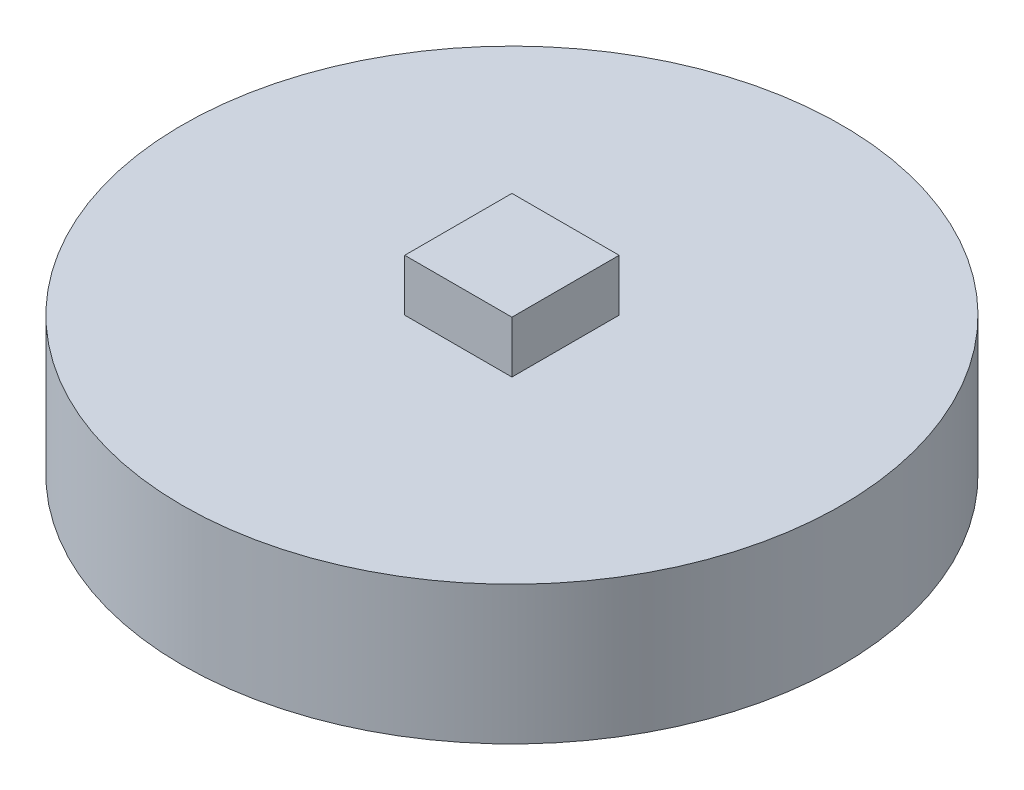
ISO-10303-21;
HEADER;
FILE_DESCRIPTION(('STEP AP214'),'2;1');
FILE_NAME('part.step','',(''),(''),'','','');
FILE_SCHEMA(('AUTOMOTIVE_DESIGN { 1 0 10303 214 1 1 1 1 }'));
ENDSEC;
DATA;
#1=APPLICATION_CONTEXT('core data for automotive mechanical design processes');
#2=APPLICATION_PROTOCOL_DEFINITION('international standard','automotive_design',2000,#1);
#3=PRODUCT_CONTEXT('',#1,'mechanical');
#4=PRODUCT('Part','Part','',(#3));
#5=PRODUCT_RELATED_PRODUCT_CATEGORY('part','',(#4));
#6=PRODUCT_DEFINITION_FORMATION('','',#4);
#7=PRODUCT_DEFINITION_CONTEXT('part definition',#1,'design');
#8=PRODUCT_DEFINITION('design','',#6,#7);
#9=PRODUCT_DEFINITION_SHAPE('','',#8);
#10=(LENGTH_UNIT() NAMED_UNIT(*) SI_UNIT(.MILLI.,.METRE.));
#11=(NAMED_UNIT(*) PLANE_ANGLE_UNIT() SI_UNIT($,.RADIAN.));
#12=(NAMED_UNIT(*) SI_UNIT($,.STERADIAN.) SOLID_ANGLE_UNIT());
#13=UNCERTAINTY_MEASURE_WITH_UNIT(LENGTH_MEASURE(1.E-05),#10,'distance_accuracy_value','');
#14=(GEOMETRIC_REPRESENTATION_CONTEXT(3) GLOBAL_UNCERTAINTY_ASSIGNED_CONTEXT((#13)) GLOBAL_UNIT_ASSIGNED_CONTEXT((#10,
#11,#12)) REPRESENTATION_CONTEXT('',''));
#15=CARTESIAN_POINT('',(0.,0.,0.));
#16=DIRECTION('',(0.,0.,1.));
#17=DIRECTION('',(1.,0.,0.));
#18=AXIS2_PLACEMENT_3D('',#15,#16,#17);
#19=CARTESIAN_POINT('',(0.,8.,0.));
#20=DIRECTION('',(0.,-1.,0.));
#21=DIRECTION('',(0.,0.,-1.));
#22=AXIS2_PLACEMENT_3D('',#19,#20,#21);
#23=CYLINDRICAL_SURFACE('',#22,19.06);
#24=CARTESIAN_POINT('',(0.,8.,0.));
#25=DIRECTION('',(0.,1.,0.));
#26=DIRECTION('',(0.,0.,1.));
#27=AXIS2_PLACEMENT_3D('',#24,#25,#26);
#28=CIRCLE('',#27,19.06);
#29=CARTESIAN_POINT('',(0.,8.,19.06));
#30=VERTEX_POINT('',#29);
#31=EDGE_CURVE('E11',#30,#30,#28,.T.);
#32=ORIENTED_EDGE('',*,*,#31,.F.);
#33=EDGE_LOOP('',(#32));
#34=FACE_BOUND('',#33,.T.);
#35=CARTESIAN_POINT('',(0.,0.,0.));
#36=DIRECTION('',(0.,1.,0.));
#37=DIRECTION('',(0.,0.,1.));
#38=AXIS2_PLACEMENT_3D('',#35,#36,#37);
#39=CIRCLE('',#38,19.06);
#40=CARTESIAN_POINT('',(0.,0.,19.06));
#41=VERTEX_POINT('',#40);
#42=EDGE_CURVE('E42',#41,#41,#39,.T.);
#43=ORIENTED_EDGE('',*,*,#42,.T.);
#44=EDGE_LOOP('',(#43));
#45=FACE_BOUND('',#44,.T.);
#46=ADVANCED_FACE('F39',(#34,#45),#23,.T.);
#47=CARTESIAN_POINT('',(0.,8.,0.));
#48=DIRECTION('',(0.,1.,0.));
#49=DIRECTION('',(0.,0.,1.));
#50=AXIS2_PLACEMENT_3D('',#47,#48,#49);
#51=PLANE('',#50);
#52=DIRECTION('',(0.,0.,1.));
#53=VECTOR('',#52,1.);
#54=CARTESIAN_POINT('',(-3.1,8.,3.1));
#55=LINE('',#54,#53);
#56=CARTESIAN_POINT('',(-3.1,8.,-3.1));
#57=VERTEX_POINT('',#56);
#58=CARTESIAN_POINT('',(-3.1,8.,3.1));
#59=VERTEX_POINT('',#58);
#60=EDGE_CURVE('E53',#57,#59,#55,.T.);
#61=ORIENTED_EDGE('',*,*,#60,.F.);
#62=DIRECTION('',(-1.,0.,0.));
#63=VECTOR('',#62,1.);
#64=CARTESIAN_POINT('',(0.,8.,-3.1));
#65=LINE('',#64,#63);
#66=CARTESIAN_POINT('',(3.1,8.,-3.1));
#67=VERTEX_POINT('',#66);
#68=EDGE_CURVE('E57',#67,#57,#65,.T.);
#69=ORIENTED_EDGE('',*,*,#68,.F.);
#70=DIRECTION('',(0.,0.,-1.));
#71=VECTOR('',#70,1.);
#72=CARTESIAN_POINT('',(3.1,8.,-3.1));
#73=LINE('',#72,#71);
#74=CARTESIAN_POINT('',(3.1,8.,3.1));
#75=VERTEX_POINT('',#74);
#76=EDGE_CURVE('E108',#75,#67,#73,.T.);
#77=ORIENTED_EDGE('',*,*,#76,.F.);
#78=DIRECTION('',(1.,0.,0.));
#79=VECTOR('',#78,1.);
#80=CARTESIAN_POINT('',(3.1,8.,3.1));
#81=LINE('',#80,#79);
#82=EDGE_CURVE('E110',#59,#75,#81,.T.);
#83=ORIENTED_EDGE('',*,*,#82,.F.);
#84=EDGE_LOOP('',(#61,#69,#77,#83));
#85=FACE_BOUND('',#84,.T.);
#86=ORIENTED_EDGE('',*,*,#31,.T.);
#87=EDGE_LOOP('',(#86));
#88=FACE_BOUND('',#87,.T.);
#89=ADVANCED_FACE('F120',(#85,#88),#51,.T.);
#90=CARTESIAN_POINT('',(0.,0.,0.));
#91=DIRECTION('',(0.,1.,0.));
#92=DIRECTION('',(0.,0.,1.));
#93=AXIS2_PLACEMENT_3D('',#90,#91,#92);
#94=PLANE('',#93);
#95=ORIENTED_EDGE('',*,*,#42,.F.);
#96=EDGE_LOOP('',(#95));
#97=FACE_BOUND('',#96,.T.);
#98=ADVANCED_FACE('F123',(#97),#94,.F.);
#99=CARTESIAN_POINT('',(-3.1,11.,3.1));
#100=DIRECTION('',(1.,0.,0.));
#101=DIRECTION('',(0.,0.,-1.));
#102=AXIS2_PLACEMENT_3D('',#99,#100,#101);
#103=PLANE('',#102);
#104=ORIENTED_EDGE('',*,*,#60,.T.);
#105=DIRECTION('',(0.,-1.,0.));
#106=VECTOR('',#105,1.);
#107=CARTESIAN_POINT('',(-3.1,11.,3.1));
#108=LINE('',#107,#106);
#109=CARTESIAN_POINT('',(-3.1,11.,3.1));
#110=VERTEX_POINT('',#109);
#111=EDGE_CURVE('E83',#110,#59,#108,.T.);
#112=ORIENTED_EDGE('',*,*,#111,.F.);
#113=DIRECTION('',(0.,0.,1.));
#114=VECTOR('',#113,1.);
#115=CARTESIAN_POINT('',(-3.1,11.,3.1));
#116=LINE('',#115,#114);
#117=CARTESIAN_POINT('',(-3.1,11.,-3.1));
#118=VERTEX_POINT('',#117);
#119=EDGE_CURVE('E77',#118,#110,#116,.T.);
#120=ORIENTED_EDGE('',*,*,#119,.F.);
#121=DIRECTION('',(0.,-1.,0.));
#122=VECTOR('',#121,1.);
#123=CARTESIAN_POINT('',(-3.1,11.,-3.1));
#124=LINE('',#123,#122);
#125=EDGE_CURVE('E81',#118,#57,#124,.T.);
#126=ORIENTED_EDGE('',*,*,#125,.T.);
#127=EDGE_LOOP('',(#104,#112,#120,#126));
#128=FACE_BOUND('',#127,.T.);
#129=ADVANCED_FACE('F79',(#128),#103,.F.);
#130=CARTESIAN_POINT('',(3.1,11.,3.1));
#131=DIRECTION('',(0.,0.,-1.));
#132=DIRECTION('',(-1.,0.,0.));
#133=AXIS2_PLACEMENT_3D('',#130,#131,#132);
#134=PLANE('',#133);
#135=ORIENTED_EDGE('',*,*,#82,.T.);
#136=DIRECTION('',(0.,-1.,0.));
#137=VECTOR('',#136,1.);
#138=CARTESIAN_POINT('',(3.1,11.,3.1));
#139=LINE('',#138,#137);
#140=CARTESIAN_POINT('',(3.1,11.,3.1));
#141=VERTEX_POINT('',#140);
#142=EDGE_CURVE('E100',#141,#75,#139,.T.);
#143=ORIENTED_EDGE('',*,*,#142,.F.);
#144=DIRECTION('',(1.,0.,0.));
#145=VECTOR('',#144,1.);
#146=CARTESIAN_POINT('',(3.1,11.,3.1));
#147=LINE('',#146,#145);
#148=EDGE_CURVE('E86',#110,#141,#147,.T.);
#149=ORIENTED_EDGE('',*,*,#148,.F.);
#150=ORIENTED_EDGE('',*,*,#111,.T.);
#151=EDGE_LOOP('',(#135,#143,#149,#150));
#152=FACE_BOUND('',#151,.T.);
#153=ADVANCED_FACE('F117',(#152),#134,.F.);
#154=CARTESIAN_POINT('',(3.1,11.,-3.1));
#155=DIRECTION('',(-1.,0.,0.));
#156=DIRECTION('',(0.,0.,1.));
#157=AXIS2_PLACEMENT_3D('',#154,#155,#156);
#158=PLANE('',#157);
#159=ORIENTED_EDGE('',*,*,#76,.T.);
#160=DIRECTION('',(0.,-1.,0.));
#161=VECTOR('',#160,1.);
#162=CARTESIAN_POINT('',(3.1,11.,-3.1));
#163=LINE('',#162,#161);
#164=CARTESIAN_POINT('',(3.1,11.,-3.1));
#165=VERTEX_POINT('',#164);
#166=EDGE_CURVE('E105',#165,#67,#163,.T.);
#167=ORIENTED_EDGE('',*,*,#166,.F.);
#168=DIRECTION('',(0.,0.,-1.));
#169=VECTOR('',#168,1.);
#170=CARTESIAN_POINT('',(3.1,11.,-3.1));
#171=LINE('',#170,#169);
#172=EDGE_CURVE('E92',#141,#165,#171,.T.);
#173=ORIENTED_EDGE('',*,*,#172,.F.);
#174=ORIENTED_EDGE('',*,*,#142,.T.);
#175=EDGE_LOOP('',(#159,#167,#173,#174));
#176=FACE_BOUND('',#175,.T.);
#177=ADVANCED_FACE('F119',(#176),#158,.F.);
#178=CARTESIAN_POINT('',(0.,11.,-3.1));
#179=DIRECTION('',(0.,0.,1.));
#180=DIRECTION('',(1.,0.,0.));
#181=AXIS2_PLACEMENT_3D('',#178,#179,#180);
#182=PLANE('',#181);
#183=ORIENTED_EDGE('',*,*,#68,.T.);
#184=ORIENTED_EDGE('',*,*,#125,.F.);
#185=DIRECTION('',(-1.,0.,0.));
#186=VECTOR('',#185,1.);
#187=CARTESIAN_POINT('',(-3.1,11.,-3.1));
#188=LINE('',#187,#186);
#189=EDGE_CURVE('E87',#165,#118,#188,.T.);
#190=ORIENTED_EDGE('',*,*,#189,.F.);
#191=ORIENTED_EDGE('',*,*,#166,.T.);
#192=EDGE_LOOP('',(#183,#184,#190,#191));
#193=FACE_BOUND('',#192,.T.);
#194=ADVANCED_FACE('F97',(#193),#182,.F.);
#195=CARTESIAN_POINT('',(0.,11.,0.));
#196=DIRECTION('',(0.,-1.,0.));
#197=DIRECTION('',(0.,0.,-1.));
#198=AXIS2_PLACEMENT_3D('',#195,#196,#197);
#199=PLANE('',#198);
#200=ORIENTED_EDGE('',*,*,#189,.T.);
#201=ORIENTED_EDGE('',*,*,#119,.T.);
#202=ORIENTED_EDGE('',*,*,#148,.T.);
#203=ORIENTED_EDGE('',*,*,#172,.T.);
#204=EDGE_LOOP('',(#200,#201,#202,#203));
#205=FACE_BOUND('',#204,.T.);
#206=ADVANCED_FACE('F90',(#205),#199,.F.);
#207=CLOSED_SHELL('',(#46,#89,#98,#129,#153,#177,#194,#206));
#208=MANIFOLD_SOLID_BREP('B2',#207);
#209=ADVANCED_BREP_SHAPE_REPRESENTATION('',(#18,#208),#14);
#210=SHAPE_DEFINITION_REPRESENTATION(#9,#209);
ENDSEC;
END-ISO-10303-21;
